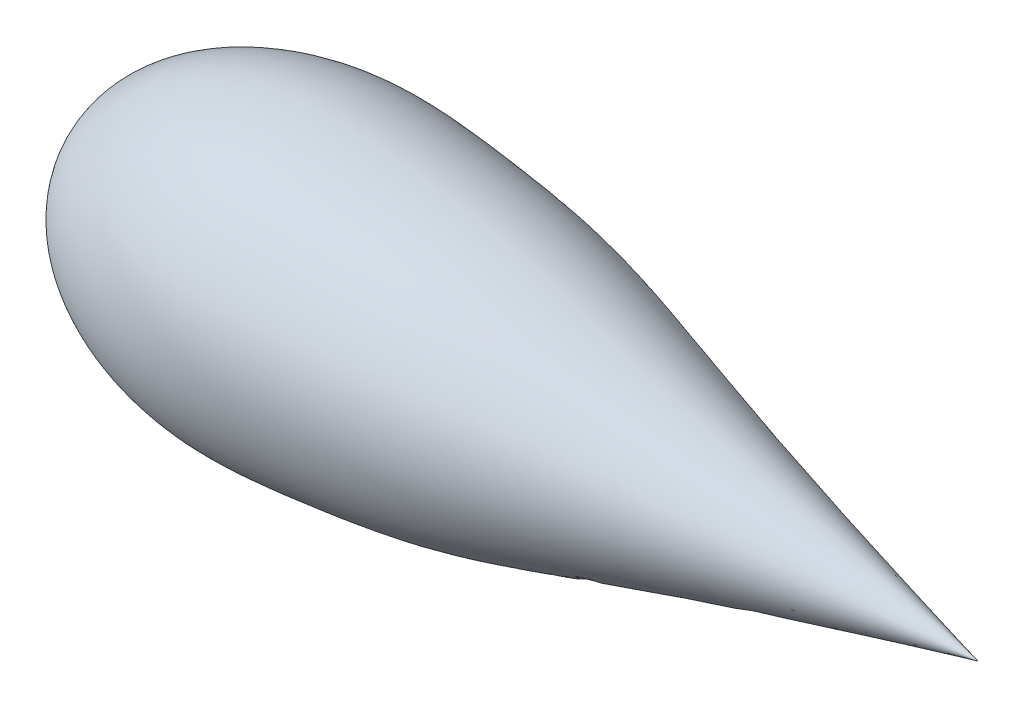
ISO-10303-21;
HEADER;
FILE_DESCRIPTION(('STEP AP214'),'2;1');
FILE_NAME('part.step','',(''),(''),'','','');
FILE_SCHEMA(('AUTOMOTIVE_DESIGN { 1 0 10303 214 1 1 1 1 }'));
ENDSEC;
DATA;
#1=APPLICATION_CONTEXT('core data for automotive mechanical design processes');
#2=APPLICATION_PROTOCOL_DEFINITION('international standard','automotive_design',2000,#1);
#3=PRODUCT_CONTEXT('',#1,'mechanical');
#4=PRODUCT('Part','Part','',(#3));
#5=PRODUCT_RELATED_PRODUCT_CATEGORY('part','',(#4));
#6=PRODUCT_DEFINITION_FORMATION('','',#4);
#7=PRODUCT_DEFINITION_CONTEXT('part definition',#1,'design');
#8=PRODUCT_DEFINITION('design','',#6,#7);
#9=PRODUCT_DEFINITION_SHAPE('','',#8);
#10=(LENGTH_UNIT() NAMED_UNIT(*) SI_UNIT(.MILLI.,.METRE.));
#11=(NAMED_UNIT(*) PLANE_ANGLE_UNIT() SI_UNIT($,.RADIAN.));
#12=(NAMED_UNIT(*) SI_UNIT($,.STERADIAN.) SOLID_ANGLE_UNIT());
#13=UNCERTAINTY_MEASURE_WITH_UNIT(LENGTH_MEASURE(1.E-05),#10,'distance_accuracy_value','');
#14=(GEOMETRIC_REPRESENTATION_CONTEXT(3) GLOBAL_UNCERTAINTY_ASSIGNED_CONTEXT((#13)) GLOBAL_UNIT_ASSIGNED_CONTEXT((#10,
#11,#12)) REPRESENTATION_CONTEXT('',''));
#15=CARTESIAN_POINT('',(0.,0.,0.));
#16=DIRECTION('',(0.,0.,1.));
#17=DIRECTION('',(1.,0.,0.));
#18=AXIS2_PLACEMENT_3D('',#15,#16,#17);
#19=CARTESIAN_POINT('',(662.850507407809,1.177271022146E-13,-0.000361932862749888));
#20=CARTESIAN_POINT('',(246.551006713318,101.85277091397,-0.000361932862749888));
#21=CARTESIAN_POINT('',(293.374551377113,119.549441567234,-0.000361932862749888));
#22=CARTESIAN_POINT('',(-52.7716512123963,149.557695105705,-0.000361932862749888));
#23=CARTESIAN_POINT('',(-177.149492591596,83.1313868699797,-0.000361932862749888));
#24=CARTESIAN_POINT('',(-177.149492592191,-2.75519172906715E-12,-0.000361932862749888));
#25=B_SPLINE_CURVE_WITH_KNOTS('',3,(#19,#20,#21,#22,#23,#24),.UNSPECIFIED.,.F.,.F.,(4,1,1,4),
(0.,0.63921935506069,0.73921935506069,1.),.UNSPECIFIED.);
#26=CARTESIAN_POINT('',(-177.149492592191,0.,-0.000361932862749888));
#27=DIRECTION('',(-1.,0.,0.));
#28=AXIS1_PLACEMENT('',#26,#27);
#29=SURFACE_OF_REVOLUTION('',#25,#28);
#30=CARTESIAN_POINT('',(-177.149492592191,0.,-0.000361932862749888));
#31=VERTEX_POINT('',#30);
#32=VERTEX_LOOP('',#31);
#33=FACE_BOUND('',#32,.T.);
#34=CARTESIAN_POINT('',(662.850507407809,1.21393516387528E-13,-0.000361932862749888));
#35=VERTEX_POINT('',#34);
#36=VERTEX_LOOP('',#35);
#37=FACE_BOUND('',#36,.T.);
#38=ADVANCED_FACE('F43',(#33,#37),#29,.T.);
#39=CLOSED_SHELL('',(#38));
#40=MANIFOLD_SOLID_BREP('B2',#39);
#41=ADVANCED_BREP_SHAPE_REPRESENTATION('',(#18,#40),#14);
#42=SHAPE_DEFINITION_REPRESENTATION(#9,#41);
ENDSEC;
END-ISO-10303-21;
